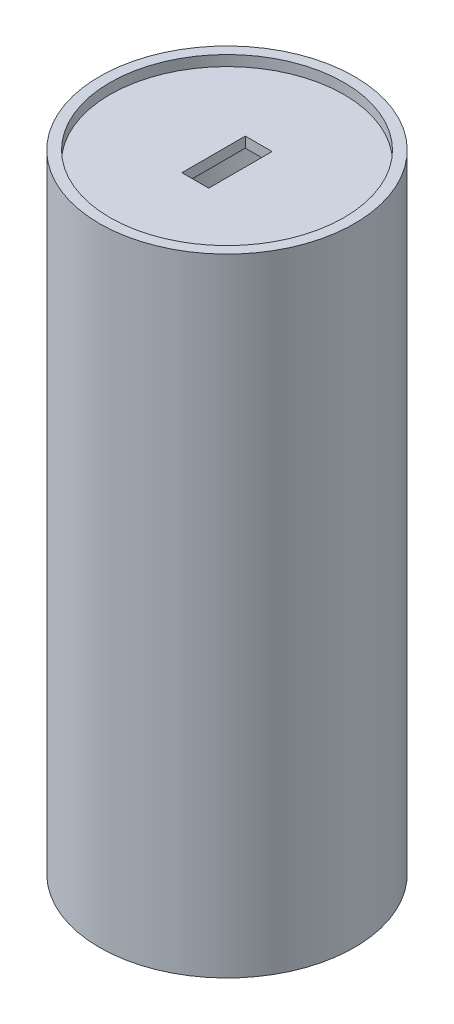
ISO-10303-21;
HEADER;
FILE_DESCRIPTION(('STEP AP214'),'2;1');
FILE_NAME('part.step','',(''),(''),'','','');
FILE_SCHEMA(('AUTOMOTIVE_DESIGN { 1 0 10303 214 1 1 1 1 }'));
ENDSEC;
DATA;
#1=APPLICATION_CONTEXT('core data for automotive mechanical design processes');
#2=APPLICATION_PROTOCOL_DEFINITION('international standard','automotive_design',2000,#1);
#3=PRODUCT_CONTEXT('',#1,'mechanical');
#4=PRODUCT('Part','Part','',(#3));
#5=PRODUCT_RELATED_PRODUCT_CATEGORY('part','',(#4));
#6=PRODUCT_DEFINITION_FORMATION('','',#4);
#7=PRODUCT_DEFINITION_CONTEXT('part definition',#1,'design');
#8=PRODUCT_DEFINITION('design','',#6,#7);
#9=PRODUCT_DEFINITION_SHAPE('','',#8);
#10=(LENGTH_UNIT() NAMED_UNIT(*) SI_UNIT(.MILLI.,.METRE.));
#11=(NAMED_UNIT(*) PLANE_ANGLE_UNIT() SI_UNIT($,.RADIAN.));
#12=(NAMED_UNIT(*) SI_UNIT($,.STERADIAN.) SOLID_ANGLE_UNIT());
#13=UNCERTAINTY_MEASURE_WITH_UNIT(LENGTH_MEASURE(1.E-05),#10,'distance_accuracy_value','');
#14=(GEOMETRIC_REPRESENTATION_CONTEXT(3) GLOBAL_UNCERTAINTY_ASSIGNED_CONTEXT((#13)) GLOBAL_UNIT_ASSIGNED_CONTEXT((#10,
#11,#12)) REPRESENTATION_CONTEXT('',''));
#15=CARTESIAN_POINT('',(0.,0.,0.));
#16=DIRECTION('',(0.,0.,1.));
#17=DIRECTION('',(1.,0.,0.));
#18=AXIS2_PLACEMENT_3D('',#15,#16,#17);
#19=CARTESIAN_POINT('',(0.,290.,0.));
#20=DIRECTION('',(0.,1.,0.));
#21=DIRECTION('',(0.,0.,1.));
#22=AXIS2_PLACEMENT_3D('',#19,#20,#21);
#23=PLANE('',#22);
#24=CARTESIAN_POINT('',(0.,290.,0.));
#25=DIRECTION('',(0.,1.,0.));
#26=DIRECTION('',(0.,0.,1.));
#27=AXIS2_PLACEMENT_3D('',#24,#25,#26);
#28=CIRCLE('',#27,56.);
#29=CARTESIAN_POINT('',(0.,290.,56.));
#30=VERTEX_POINT('',#29);
#31=EDGE_CURVE('E104',#30,#30,#28,.T.);
#32=ORIENTED_EDGE('',*,*,#31,.F.);
#33=EDGE_LOOP('',(#32));
#34=FACE_BOUND('',#33,.T.);
#35=DIRECTION('',(1.,0.,0.));
#36=VECTOR('',#35,1.);
#37=CARTESIAN_POINT('',(-6.41,290.,-15.17));
#38=LINE('',#37,#36);
#39=CARTESIAN_POINT('',(-6.41,290.,-15.17));
#40=VERTEX_POINT('',#39);
#41=CARTESIAN_POINT('',(6.41,290.,-15.17));
#42=VERTEX_POINT('',#41);
#43=EDGE_CURVE('E98',#40,#42,#38,.T.);
#44=ORIENTED_EDGE('',*,*,#43,.F.);
#45=DIRECTION('',(0.,0.,-1.));
#46=VECTOR('',#45,1.);
#47=CARTESIAN_POINT('',(-6.41,290.,-15.17));
#48=LINE('',#47,#46);
#49=CARTESIAN_POINT('',(-6.41,290.,15.17));
#50=VERTEX_POINT('',#49);
#51=EDGE_CURVE('E113',#50,#40,#48,.T.);
#52=ORIENTED_EDGE('',*,*,#51,.F.);
#53=DIRECTION('',(-1.,0.,0.));
#54=VECTOR('',#53,1.);
#55=CARTESIAN_POINT('',(-6.41,290.,15.17));
#56=LINE('',#55,#54);
#57=CARTESIAN_POINT('',(6.41,290.,15.17));
#58=VERTEX_POINT('',#57);
#59=EDGE_CURVE('E57',#58,#50,#56,.T.);
#60=ORIENTED_EDGE('',*,*,#59,.F.);
#61=DIRECTION('',(0.,0.,1.));
#62=VECTOR('',#61,1.);
#63=CARTESIAN_POINT('',(6.41,290.,-15.17));
#64=LINE('',#63,#62);
#65=EDGE_CURVE('E87',#42,#58,#64,.T.);
#66=ORIENTED_EDGE('',*,*,#65,.F.);
#67=EDGE_LOOP('',(#44,#52,#60,#66));
#68=FACE_BOUND('',#67,.T.);
#69=ADVANCED_FACE('F41',(#34,#68),#23,.F.);
#70=CARTESIAN_POINT('',(0.,300.,0.));
#71=DIRECTION('',(0.,-1.,0.));
#72=DIRECTION('',(0.,0.,-1.));
#73=AXIS2_PLACEMENT_3D('',#70,#71,#72);
#74=CYLINDRICAL_SURFACE('',#73,56.);
#75=CARTESIAN_POINT('',(0.,25.,0.));
#76=DIRECTION('',(0.,1.,0.));
#77=DIRECTION('',(0.,0.,1.));
#78=AXIS2_PLACEMENT_3D('',#75,#76,#77);
#79=CIRCLE('',#78,56.);
#80=CARTESIAN_POINT('',(0.,25.,56.));
#81=VERTEX_POINT('',#80);
#82=EDGE_CURVE('E50',#81,#81,#79,.T.);
#83=ORIENTED_EDGE('',*,*,#82,.F.);
#84=EDGE_LOOP('',(#83));
#85=FACE_BOUND('',#84,.T.);
#86=ORIENTED_EDGE('',*,*,#31,.T.);
#87=EDGE_LOOP('',(#86));
#88=FACE_BOUND('',#87,.T.);
#89=ADVANCED_FACE('F191',(#85,#88),#74,.F.);
#90=CARTESIAN_POINT('',(0.,0.,0.));
#91=DIRECTION('',(0.,1.,0.));
#92=DIRECTION('',(0.,0.,1.));
#93=AXIS2_PLACEMENT_3D('',#90,#91,#92);
#94=CIRCLE('',#93,56.);
#95=CARTESIAN_POINT('',(0.,0.,56.));
#96=VERTEX_POINT('',#95);
#97=EDGE_CURVE('E170',#96,#96,#94,.T.);
#98=ORIENTED_EDGE('',*,*,#97,.F.);
#99=EDGE_LOOP('',(#98));
#100=FACE_BOUND('',#99,.T.);
#101=CARTESIAN_POINT('',(0.,20.,0.));
#102=DIRECTION('',(0.,1.,0.));
#103=DIRECTION('',(0.,0.,1.));
#104=AXIS2_PLACEMENT_3D('',#101,#102,#103);
#105=CIRCLE('',#104,56.);
#106=CARTESIAN_POINT('',(0.,20.,56.));
#107=VERTEX_POINT('',#106);
#108=EDGE_CURVE('E139',#107,#107,#105,.T.);
#109=ORIENTED_EDGE('',*,*,#108,.T.);
#110=EDGE_LOOP('',(#109));
#111=FACE_BOUND('',#110,.T.);
#112=ADVANCED_FACE('F194',(#100,#111),#74,.F.);
#113=CARTESIAN_POINT('',(0.,295.,0.));
#114=DIRECTION('',(0.,1.,0.));
#115=DIRECTION('',(0.,0.,1.));
#116=AXIS2_PLACEMENT_3D('',#113,#114,#115);
#117=CIRCLE('',#116,56.);
#118=CARTESIAN_POINT('',(0.,295.,56.));
#119=VERTEX_POINT('',#118);
#120=EDGE_CURVE('E11',#119,#119,#117,.T.);
#121=ORIENTED_EDGE('',*,*,#120,.F.);
#122=EDGE_LOOP('',(#121));
#123=FACE_BOUND('',#122,.T.);
#124=CARTESIAN_POINT('',(0.,300.,0.));
#125=DIRECTION('',(0.,1.,0.));
#126=DIRECTION('',(0.,0.,1.));
#127=AXIS2_PLACEMENT_3D('',#124,#125,#126);
#128=CIRCLE('',#127,56.);
#129=CARTESIAN_POINT('',(0.,300.,56.));
#130=VERTEX_POINT('',#129);
#131=EDGE_CURVE('E171',#130,#130,#128,.T.);
#132=ORIENTED_EDGE('',*,*,#131,.T.);
#133=EDGE_LOOP('',(#132));
#134=FACE_BOUND('',#133,.T.);
#135=ADVANCED_FACE('F43',(#123,#134),#74,.F.);
#136=CARTESIAN_POINT('',(0.,300.,0.));
#137=DIRECTION('',(0.,-1.,0.));
#138=DIRECTION('',(0.,0.,-1.));
#139=AXIS2_PLACEMENT_3D('',#136,#137,#138);
#140=CYLINDRICAL_SURFACE('',#139,61.);
#141=CARTESIAN_POINT('',(0.,300.,0.));
#142=DIRECTION('',(0.,1.,0.));
#143=DIRECTION('',(0.,0.,1.));
#144=AXIS2_PLACEMENT_3D('',#141,#142,#143);
#145=CIRCLE('',#144,61.);
#146=CARTESIAN_POINT('',(0.,300.,61.));
#147=VERTEX_POINT('',#146);
#148=EDGE_CURVE('E175',#147,#147,#145,.T.);
#149=ORIENTED_EDGE('',*,*,#148,.F.);
#150=EDGE_LOOP('',(#149));
#151=FACE_BOUND('',#150,.T.);
#152=CARTESIAN_POINT('',(0.,0.,0.));
#153=DIRECTION('',(0.,1.,0.));
#154=DIRECTION('',(0.,0.,1.));
#155=AXIS2_PLACEMENT_3D('',#152,#153,#154);
#156=CIRCLE('',#155,61.);
#157=CARTESIAN_POINT('',(0.,0.,61.));
#158=VERTEX_POINT('',#157);
#159=EDGE_CURVE('E176',#158,#158,#156,.T.);
#160=ORIENTED_EDGE('',*,*,#159,.T.);
#161=EDGE_LOOP('',(#160));
#162=FACE_BOUND('',#161,.T.);
#163=ADVANCED_FACE('F232',(#151,#162),#140,.T.);
#164=CARTESIAN_POINT('',(0.,300.,0.));
#165=DIRECTION('',(0.,1.,0.));
#166=DIRECTION('',(0.,0.,1.));
#167=AXIS2_PLACEMENT_3D('',#164,#165,#166);
#168=PLANE('',#167);
#169=ORIENTED_EDGE('',*,*,#131,.F.);
#170=EDGE_LOOP('',(#169));
#171=FACE_BOUND('',#170,.T.);
#172=ORIENTED_EDGE('',*,*,#148,.T.);
#173=EDGE_LOOP('',(#172));
#174=FACE_BOUND('',#173,.T.);
#175=ADVANCED_FACE('F229',(#171,#174),#168,.T.);
#176=CARTESIAN_POINT('',(0.,0.,0.));
#177=DIRECTION('',(0.,1.,0.));
#178=DIRECTION('',(0.,0.,1.));
#179=AXIS2_PLACEMENT_3D('',#176,#177,#178);
#180=PLANE('',#179);
#181=ORIENTED_EDGE('',*,*,#97,.T.);
#182=EDGE_LOOP('',(#181));
#183=FACE_BOUND('',#182,.T.);
#184=ORIENTED_EDGE('',*,*,#159,.F.);
#185=EDGE_LOOP('',(#184));
#186=FACE_BOUND('',#185,.T.);
#187=ADVANCED_FACE('F227',(#183,#186),#180,.F.);
#188=CARTESIAN_POINT('',(0.,20.,0.));
#189=DIRECTION('',(0.,1.,0.));
#190=DIRECTION('',(0.,0.,1.));
#191=AXIS2_PLACEMENT_3D('',#188,#189,#190);
#192=PLANE('',#191);
#193=CARTESIAN_POINT('',(10.,20.,0.));
#194=DIRECTION('',(0.,-1.,0.));
#195=DIRECTION('',(0.,0.,-1.));
#196=AXIS2_PLACEMENT_3D('',#193,#194,#195);
#197=CIRCLE('',#196,1.5);
#198=CARTESIAN_POINT('',(10.,20.,-1.5));
#199=VERTEX_POINT('',#198);
#200=EDGE_CURVE('E135',#199,#199,#197,.T.);
#201=ORIENTED_EDGE('',*,*,#200,.F.);
#202=EDGE_LOOP('',(#201));
#203=FACE_BOUND('',#202,.T.);
#204=CARTESIAN_POINT('',(0.,20.,10.));
#205=DIRECTION('',(0.,-1.,0.));
#206=DIRECTION('',(0.,0.,-1.));
#207=AXIS2_PLACEMENT_3D('',#204,#205,#206);
#208=CIRCLE('',#207,1.5);
#209=CARTESIAN_POINT('',(0.,20.,8.5));
#210=VERTEX_POINT('',#209);
#211=EDGE_CURVE('E144',#210,#210,#208,.T.);
#212=ORIENTED_EDGE('',*,*,#211,.F.);
#213=EDGE_LOOP('',(#212));
#214=FACE_BOUND('',#213,.T.);
#215=CARTESIAN_POINT('',(-10.,20.,0.));
#216=DIRECTION('',(0.,-1.,0.));
#217=DIRECTION('',(0.,0.,-1.));
#218=AXIS2_PLACEMENT_3D('',#215,#216,#217);
#219=CIRCLE('',#218,1.5);
#220=CARTESIAN_POINT('',(-10.,20.,-1.5));
#221=VERTEX_POINT('',#220);
#222=EDGE_CURVE('E152',#221,#221,#219,.T.);
#223=ORIENTED_EDGE('',*,*,#222,.F.);
#224=EDGE_LOOP('',(#223));
#225=FACE_BOUND('',#224,.T.);
#226=CARTESIAN_POINT('',(0.,20.,-10.));
#227=DIRECTION('',(0.,-1.,0.));
#228=DIRECTION('',(0.,0.,-1.));
#229=AXIS2_PLACEMENT_3D('',#226,#227,#228);
#230=CIRCLE('',#229,1.5);
#231=CARTESIAN_POINT('',(0.,20.,-11.5));
#232=VERTEX_POINT('',#231);
#233=EDGE_CURVE('E160',#232,#232,#230,.T.);
#234=ORIENTED_EDGE('',*,*,#233,.F.);
#235=EDGE_LOOP('',(#234));
#236=FACE_BOUND('',#235,.T.);
#237=ORIENTED_EDGE('',*,*,#108,.F.);
#238=EDGE_LOOP('',(#237));
#239=FACE_BOUND('',#238,.T.);
#240=ADVANCED_FACE('F223',(#203,#214,#225,#236,#239),#192,.F.);
#241=CARTESIAN_POINT('',(0.,25.,0.));
#242=DIRECTION('',(0.,1.,0.));
#243=DIRECTION('',(0.,0.,1.));
#244=AXIS2_PLACEMENT_3D('',#241,#242,#243);
#245=PLANE('',#244);
#246=CARTESIAN_POINT('',(10.,25.,0.));
#247=DIRECTION('',(0.,1.,0.));
#248=DIRECTION('',(0.,0.,1.));
#249=AXIS2_PLACEMENT_3D('',#246,#247,#248);
#250=CIRCLE('',#249,1.5);
#251=CARTESIAN_POINT('',(10.,25.,1.5));
#252=VERTEX_POINT('',#251);
#253=EDGE_CURVE('E140',#252,#252,#250,.F.);
#254=ORIENTED_EDGE('',*,*,#253,.T.);
#255=EDGE_LOOP('',(#254));
#256=FACE_BOUND('',#255,.T.);
#257=CARTESIAN_POINT('',(0.,25.,10.));
#258=DIRECTION('',(0.,1.,0.));
#259=DIRECTION('',(0.,0.,1.));
#260=AXIS2_PLACEMENT_3D('',#257,#258,#259);
#261=CIRCLE('',#260,1.5);
#262=CARTESIAN_POINT('',(0.,25.,11.5));
#263=VERTEX_POINT('',#262);
#264=EDGE_CURVE('E148',#263,#263,#261,.F.);
#265=ORIENTED_EDGE('',*,*,#264,.T.);
#266=EDGE_LOOP('',(#265));
#267=FACE_BOUND('',#266,.T.);
#268=CARTESIAN_POINT('',(-10.,25.,0.));
#269=DIRECTION('',(0.,1.,0.));
#270=DIRECTION('',(0.,0.,1.));
#271=AXIS2_PLACEMENT_3D('',#268,#269,#270);
#272=CIRCLE('',#271,1.5);
#273=CARTESIAN_POINT('',(-10.,25.,1.5));
#274=VERTEX_POINT('',#273);
#275=EDGE_CURVE('E156',#274,#274,#272,.F.);
#276=ORIENTED_EDGE('',*,*,#275,.T.);
#277=EDGE_LOOP('',(#276));
#278=FACE_BOUND('',#277,.T.);
#279=CARTESIAN_POINT('',(0.,25.,-10.));
#280=DIRECTION('',(0.,1.,0.));
#281=DIRECTION('',(0.,0.,1.));
#282=AXIS2_PLACEMENT_3D('',#279,#280,#281);
#283=CIRCLE('',#282,1.5);
#284=CARTESIAN_POINT('',(0.,25.,-8.5));
#285=VERTEX_POINT('',#284);
#286=EDGE_CURVE('E134',#285,#285,#283,.F.);
#287=ORIENTED_EDGE('',*,*,#286,.T.);
#288=EDGE_LOOP('',(#287));
#289=FACE_BOUND('',#288,.T.);
#290=ORIENTED_EDGE('',*,*,#82,.T.);
#291=EDGE_LOOP('',(#290));
#292=FACE_BOUND('',#291,.T.);
#293=ADVANCED_FACE('F189',(#256,#267,#278,#289,#292),#245,.T.);
#294=CARTESIAN_POINT('',(0.,300.001,-10.));
#295=DIRECTION('',(0.,-1.,0.));
#296=DIRECTION('',(0.,0.,-1.));
#297=AXIS2_PLACEMENT_3D('',#294,#295,#296);
#298=CYLINDRICAL_SURFACE('',#297,1.5);
#299=ORIENTED_EDGE('',*,*,#286,.F.);
#300=EDGE_LOOP('',(#299));
#301=FACE_BOUND('',#300,.T.);
#302=ORIENTED_EDGE('',*,*,#233,.T.);
#303=EDGE_LOOP('',(#302));
#304=FACE_BOUND('',#303,.T.);
#305=ADVANCED_FACE('F216',(#301,#304),#298,.F.);
#306=CARTESIAN_POINT('',(-10.,300.001,0.));
#307=DIRECTION('',(0.,-1.,0.));
#308=DIRECTION('',(0.,0.,-1.));
#309=AXIS2_PLACEMENT_3D('',#306,#307,#308);
#310=CYLINDRICAL_SURFACE('',#309,1.5);
#311=ORIENTED_EDGE('',*,*,#275,.F.);
#312=EDGE_LOOP('',(#311));
#313=FACE_BOUND('',#312,.T.);
#314=ORIENTED_EDGE('',*,*,#222,.T.);
#315=EDGE_LOOP('',(#314));
#316=FACE_BOUND('',#315,.T.);
#317=ADVANCED_FACE('F212',(#313,#316),#310,.F.);
#318=CARTESIAN_POINT('',(0.,300.001,10.));
#319=DIRECTION('',(0.,-1.,0.));
#320=DIRECTION('',(0.,0.,-1.));
#321=AXIS2_PLACEMENT_3D('',#318,#319,#320);
#322=CYLINDRICAL_SURFACE('',#321,1.5);
#323=ORIENTED_EDGE('',*,*,#264,.F.);
#324=EDGE_LOOP('',(#323));
#325=FACE_BOUND('',#324,.T.);
#326=ORIENTED_EDGE('',*,*,#211,.T.);
#327=EDGE_LOOP('',(#326));
#328=FACE_BOUND('',#327,.T.);
#329=ADVANCED_FACE('F208',(#325,#328),#322,.F.);
#330=CARTESIAN_POINT('',(10.,300.001,0.));
#331=DIRECTION('',(0.,-1.,0.));
#332=DIRECTION('',(0.,0.,-1.));
#333=AXIS2_PLACEMENT_3D('',#330,#331,#332);
#334=CYLINDRICAL_SURFACE('',#333,1.5);
#335=ORIENTED_EDGE('',*,*,#253,.F.);
#336=EDGE_LOOP('',(#335));
#337=FACE_BOUND('',#336,.T.);
#338=ORIENTED_EDGE('',*,*,#200,.T.);
#339=EDGE_LOOP('',(#338));
#340=FACE_BOUND('',#339,.T.);
#341=ADVANCED_FACE('F205',(#337,#340),#334,.F.);
#342=CARTESIAN_POINT('',(0.,295.,0.));
#343=DIRECTION('',(0.,1.,0.));
#344=DIRECTION('',(0.,0.,1.));
#345=AXIS2_PLACEMENT_3D('',#342,#343,#344);
#346=PLANE('',#345);
#347=DIRECTION('',(0.,0.,-1.));
#348=VECTOR('',#347,1.);
#349=CARTESIAN_POINT('',(6.41,295.,-15.17));
#350=LINE('',#349,#348);
#351=CARTESIAN_POINT('',(6.41,295.,15.17));
#352=VERTEX_POINT('',#351);
#353=CARTESIAN_POINT('',(6.41,295.,-15.17));
#354=VERTEX_POINT('',#353);
#355=EDGE_CURVE('E89',#352,#354,#350,.T.);
#356=ORIENTED_EDGE('',*,*,#355,.F.);
#357=DIRECTION('',(1.,0.,0.));
#358=VECTOR('',#357,1.);
#359=CARTESIAN_POINT('',(-6.41,295.,15.17));
#360=LINE('',#359,#358);
#361=CARTESIAN_POINT('',(-6.41,295.,15.17));
#362=VERTEX_POINT('',#361);
#363=EDGE_CURVE('E95',#362,#352,#360,.T.);
#364=ORIENTED_EDGE('',*,*,#363,.F.);
#365=DIRECTION('',(0.,0.,1.));
#366=VECTOR('',#365,1.);
#367=CARTESIAN_POINT('',(-6.41,295.,-15.17));
#368=LINE('',#367,#366);
#369=CARTESIAN_POINT('',(-6.41,295.,-15.17));
#370=VERTEX_POINT('',#369);
#371=EDGE_CURVE('E64',#370,#362,#368,.T.);
#372=ORIENTED_EDGE('',*,*,#371,.F.);
#373=DIRECTION('',(-1.,0.,0.));
#374=VECTOR('',#373,1.);
#375=CARTESIAN_POINT('',(-6.41,295.,-15.17));
#376=LINE('',#375,#374);
#377=EDGE_CURVE('E111',#354,#370,#376,.T.);
#378=ORIENTED_EDGE('',*,*,#377,.F.);
#379=EDGE_LOOP('',(#356,#364,#372,#378));
#380=FACE_BOUND('',#379,.T.);
#381=ORIENTED_EDGE('',*,*,#120,.T.);
#382=EDGE_LOOP('',(#381));
#383=FACE_BOUND('',#382,.T.);
#384=ADVANCED_FACE('F203',(#380,#383),#346,.T.);
#385=CARTESIAN_POINT('',(-6.41,-0.000999999999973245,-15.17));
#386=DIRECTION('',(0.,0.,-1.));
#387=DIRECTION('',(-1.,0.,0.));
#388=AXIS2_PLACEMENT_3D('',#385,#386,#387);
#389=PLANE('',#388);
#390=ORIENTED_EDGE('',*,*,#43,.T.);
#391=DIRECTION('',(0.,1.,0.));
#392=VECTOR('',#391,1.);
#393=CARTESIAN_POINT('',(6.41,-0.000999999999973245,-15.17));
#394=LINE('',#393,#392);
#395=EDGE_CURVE('E83',#42,#354,#394,.T.);
#396=ORIENTED_EDGE('',*,*,#395,.T.);
#397=ORIENTED_EDGE('',*,*,#377,.T.);
#398=DIRECTION('',(0.,1.,0.));
#399=VECTOR('',#398,1.);
#400=CARTESIAN_POINT('',(-6.41,-0.000999999999973245,-15.17));
#401=LINE('',#400,#399);
#402=EDGE_CURVE('E94',#40,#370,#401,.T.);
#403=ORIENTED_EDGE('',*,*,#402,.F.);
#404=EDGE_LOOP('',(#390,#396,#397,#403));
#405=FACE_BOUND('',#404,.T.);
#406=ADVANCED_FACE('F99',(#405),#389,.F.);
#407=CARTESIAN_POINT('',(-6.41,-0.000999999999973245,-15.17));
#408=DIRECTION('',(-1.,0.,0.));
#409=DIRECTION('',(0.,0.,1.));
#410=AXIS2_PLACEMENT_3D('',#407,#408,#409);
#411=PLANE('',#410);
#412=ORIENTED_EDGE('',*,*,#51,.T.);
#413=ORIENTED_EDGE('',*,*,#402,.T.);
#414=ORIENTED_EDGE('',*,*,#371,.T.);
#415=DIRECTION('',(0.,1.,0.));
#416=VECTOR('',#415,1.);
#417=CARTESIAN_POINT('',(-6.41,-0.000999999999973245,15.17));
#418=LINE('',#417,#416);
#419=EDGE_CURVE('E126',#50,#362,#418,.T.);
#420=ORIENTED_EDGE('',*,*,#419,.F.);
#421=EDGE_LOOP('',(#412,#413,#414,#420));
#422=FACE_BOUND('',#421,.T.);
#423=ADVANCED_FACE('F260',(#422),#411,.F.);
#424=CARTESIAN_POINT('',(-6.41,-0.000999999999973245,15.17));
#425=DIRECTION('',(0.,0.,1.));
#426=DIRECTION('',(1.,0.,0.));
#427=AXIS2_PLACEMENT_3D('',#424,#425,#426);
#428=PLANE('',#427);
#429=ORIENTED_EDGE('',*,*,#59,.T.);
#430=ORIENTED_EDGE('',*,*,#419,.T.);
#431=ORIENTED_EDGE('',*,*,#363,.T.);
#432=DIRECTION('',(0.,1.,0.));
#433=VECTOR('',#432,1.);
#434=CARTESIAN_POINT('',(6.41,-0.000999999999973245,15.17));
#435=LINE('',#434,#433);
#436=EDGE_CURVE('E105',#58,#352,#435,.T.);
#437=ORIENTED_EDGE('',*,*,#436,.F.);
#438=EDGE_LOOP('',(#429,#430,#431,#437));
#439=FACE_BOUND('',#438,.T.);
#440=ADVANCED_FACE('F263',(#439),#428,.F.);
#441=CARTESIAN_POINT('',(6.41,-0.000999999999973245,-15.17));
#442=DIRECTION('',(1.,0.,0.));
#443=DIRECTION('',(0.,0.,-1.));
#444=AXIS2_PLACEMENT_3D('',#441,#442,#443);
#445=PLANE('',#444);
#446=ORIENTED_EDGE('',*,*,#65,.T.);
#447=ORIENTED_EDGE('',*,*,#436,.T.);
#448=ORIENTED_EDGE('',*,*,#355,.T.);
#449=ORIENTED_EDGE('',*,*,#395,.F.);
#450=EDGE_LOOP('',(#446,#447,#448,#449));
#451=FACE_BOUND('',#450,.T.);
#452=ADVANCED_FACE('F85',(#451),#445,.F.);
#453=CLOSED_SHELL('',(#69,#89,#112,#135,#163,#175,#187,#240,#293,#305,#317,#329,#341,#384,#406,
#423,#440,#452));
#454=MANIFOLD_SOLID_BREP('B2',#453);
#455=ADVANCED_BREP_SHAPE_REPRESENTATION('',(#18,#454),#14);
#456=SHAPE_DEFINITION_REPRESENTATION(#9,#455);
ENDSEC;
END-ISO-10303-21;
